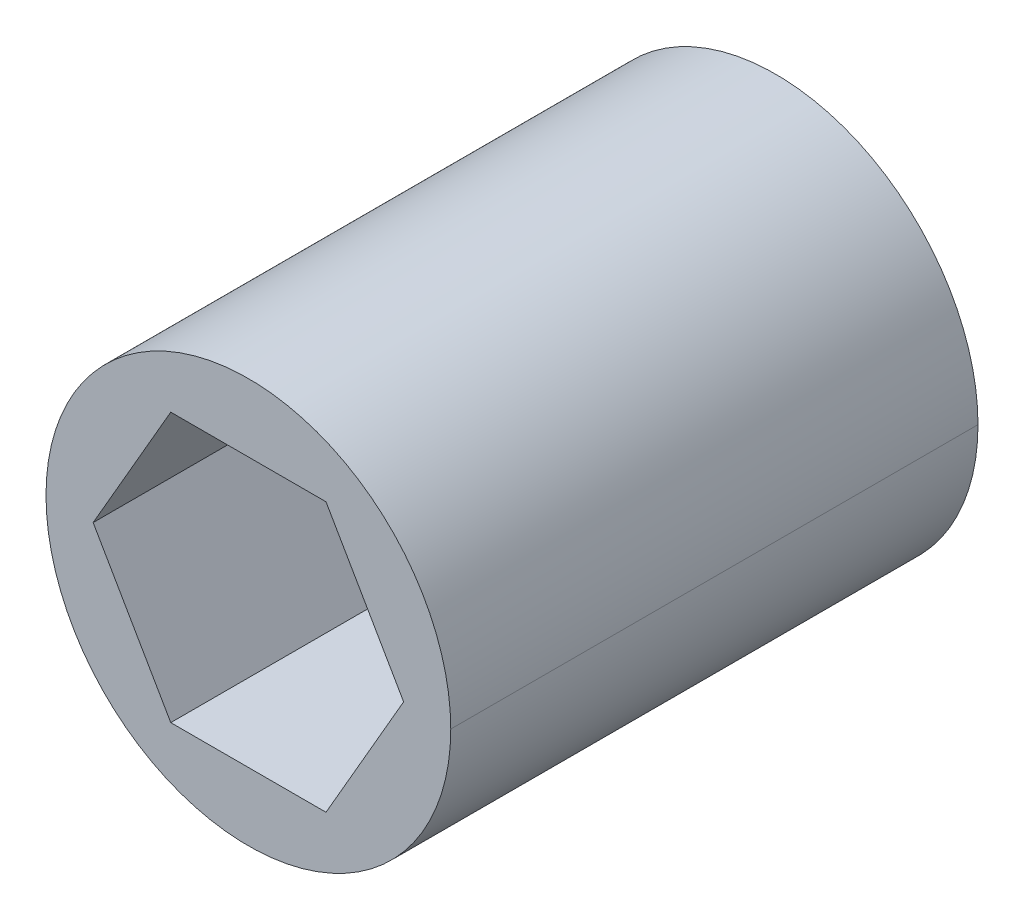
ISO-10303-21;
HEADER;
FILE_DESCRIPTION(('STEP AP214'),'2;1');
FILE_NAME('part.step','',(''),(''),'','','');
FILE_SCHEMA(('AUTOMOTIVE_DESIGN { 1 0 10303 214 1 1 1 1 }'));
ENDSEC;
DATA;
#1=APPLICATION_CONTEXT('core data for automotive mechanical design processes');
#2=APPLICATION_PROTOCOL_DEFINITION('international standard','automotive_design',2000,#1);
#3=PRODUCT_CONTEXT('',#1,'mechanical');
#4=PRODUCT('Part','Part','',(#3));
#5=PRODUCT_RELATED_PRODUCT_CATEGORY('part','',(#4));
#6=PRODUCT_DEFINITION_FORMATION('','',#4);
#7=PRODUCT_DEFINITION_CONTEXT('part definition',#1,'design');
#8=PRODUCT_DEFINITION('design','',#6,#7);
#9=PRODUCT_DEFINITION_SHAPE('','',#8);
#10=(LENGTH_UNIT() NAMED_UNIT(*) SI_UNIT(.MILLI.,.METRE.));
#11=(NAMED_UNIT(*) PLANE_ANGLE_UNIT() SI_UNIT($,.RADIAN.));
#12=(NAMED_UNIT(*) SI_UNIT($,.STERADIAN.) SOLID_ANGLE_UNIT());
#13=UNCERTAINTY_MEASURE_WITH_UNIT(LENGTH_MEASURE(1.E-05),#10,'distance_accuracy_value','');
#14=(GEOMETRIC_REPRESENTATION_CONTEXT(3) GLOBAL_UNCERTAINTY_ASSIGNED_CONTEXT((#13)) GLOBAL_UNIT_ASSIGNED_CONTEXT((#10,
#11,#12)) REPRESENTATION_CONTEXT('',''));
#15=CARTESIAN_POINT('',(0.,0.,0.));
#16=DIRECTION('',(0.,0.,1.));
#17=DIRECTION('',(1.,0.,0.));
#18=AXIS2_PLACEMENT_3D('',#15,#16,#17);
#19=CARTESIAN_POINT('',(-7.47899538708241,0.,12.7));
#20=DIRECTION('',(0.866025403784439,0.5,0.));
#21=DIRECTION('',(0.,0.,-1.));
#22=AXIS2_PLACEMENT_3D('',#19,#20,#21);
#23=PLANE('',#22);
#24=DIRECTION('',(0.5,-0.866025403784439,0.));
#25=VECTOR('',#24,1.);
#26=CARTESIAN_POINT('',(-7.47899538708241,0.,-12.7));
#27=LINE('',#26,#25);
#28=CARTESIAN_POINT('',(-7.47899538708241,0.,-12.7));
#29=VERTEX_POINT('',#28);
#30=CARTESIAN_POINT('',(-3.7394976935412,-6.477,-12.7));
#31=VERTEX_POINT('',#30);
#32=EDGE_CURVE('E153',#29,#31,#27,.T.);
#33=ORIENTED_EDGE('',*,*,#32,.F.);
#34=DIRECTION('',(0.,0.,-1.));
#35=VECTOR('',#34,1.);
#36=CARTESIAN_POINT('',(-7.47899538708241,0.,12.7));
#37=LINE('',#36,#35);
#38=CARTESIAN_POINT('',(-7.47899538708242,0.,12.7));
#39=VERTEX_POINT('',#38);
#40=EDGE_CURVE('E10',#39,#29,#37,.T.);
#41=ORIENTED_EDGE('',*,*,#40,.F.);
#42=DIRECTION('',(0.5,-0.866025403784439,0.));
#43=VECTOR('',#42,1.);
#44=CARTESIAN_POINT('',(-7.47899538708241,0.,12.7));
#45=LINE('',#44,#43);
#46=CARTESIAN_POINT('',(-3.7394976935412,-6.477,12.7));
#47=VERTEX_POINT('',#46);
#48=EDGE_CURVE('E162',#39,#47,#45,.T.);
#49=ORIENTED_EDGE('',*,*,#48,.T.);
#50=DIRECTION('',(0.,0.,-1.));
#51=VECTOR('',#50,1.);
#52=CARTESIAN_POINT('',(-3.7394976935412,-6.477,12.7));
#53=LINE('',#52,#51);
#54=EDGE_CURVE('E95',#47,#31,#53,.T.);
#55=ORIENTED_EDGE('',*,*,#54,.T.);
#56=EDGE_LOOP('',(#33,#41,#49,#55));
#57=FACE_BOUND('',#56,.T.);
#58=ADVANCED_FACE('F16',(#57),#23,.T.);
#59=CARTESIAN_POINT('',(-3.73949769354121,6.477,12.7));
#60=DIRECTION('',(0.866025403784439,-0.5,0.));
#61=DIRECTION('',(0.,0.,-1.));
#62=AXIS2_PLACEMENT_3D('',#59,#60,#61);
#63=PLANE('',#62);
#64=DIRECTION('',(-0.5,-0.866025403784439,0.));
#65=VECTOR('',#64,1.);
#66=CARTESIAN_POINT('',(-3.73949769354121,6.477,-12.7));
#67=LINE('',#66,#65);
#68=CARTESIAN_POINT('',(-3.73949769354121,6.477,-12.7));
#69=VERTEX_POINT('',#68);
#70=EDGE_CURVE('E170',#69,#29,#67,.T.);
#71=ORIENTED_EDGE('',*,*,#70,.F.);
#72=DIRECTION('',(0.,0.,-1.));
#73=VECTOR('',#72,1.);
#74=CARTESIAN_POINT('',(-3.73949769354121,6.477,12.7));
#75=LINE('',#74,#73);
#76=CARTESIAN_POINT('',(-3.73949769354121,6.477,12.7));
#77=VERTEX_POINT('',#76);
#78=EDGE_CURVE('E27',#77,#69,#75,.T.);
#79=ORIENTED_EDGE('',*,*,#78,.F.);
#80=DIRECTION('',(-0.5,-0.866025403784439,0.));
#81=VECTOR('',#80,1.);
#82=CARTESIAN_POINT('',(-3.73949769354121,6.477,12.7));
#83=LINE('',#82,#81);
#84=EDGE_CURVE('E158',#77,#39,#83,.T.);
#85=ORIENTED_EDGE('',*,*,#84,.T.);
#86=ORIENTED_EDGE('',*,*,#40,.T.);
#87=EDGE_LOOP('',(#71,#79,#85,#86));
#88=FACE_BOUND('',#87,.T.);
#89=ADVANCED_FACE('F273',(#88),#63,.T.);
#90=CARTESIAN_POINT('',(3.7394976935412,6.477,12.7));
#91=DIRECTION('',(0.,-1.,0.));
#92=DIRECTION('',(0.,0.,-1.));
#93=AXIS2_PLACEMENT_3D('',#90,#91,#92);
#94=PLANE('',#93);
#95=DIRECTION('',(-1.,0.,0.));
#96=VECTOR('',#95,1.);
#97=CARTESIAN_POINT('',(3.7394976935412,6.477,-12.7));
#98=LINE('',#97,#96);
#99=CARTESIAN_POINT('',(3.7394976935412,6.477,-12.7));
#100=VERTEX_POINT('',#99);
#101=EDGE_CURVE('E173',#100,#69,#98,.T.);
#102=ORIENTED_EDGE('',*,*,#101,.F.);
#103=DIRECTION('',(0.,0.,-1.));
#104=VECTOR('',#103,1.);
#105=CARTESIAN_POINT('',(3.7394976935412,6.477,12.7));
#106=LINE('',#105,#104);
#107=CARTESIAN_POINT('',(3.7394976935412,6.477,12.7));
#108=VERTEX_POINT('',#107);
#109=EDGE_CURVE('E150',#108,#100,#106,.T.);
#110=ORIENTED_EDGE('',*,*,#109,.F.);
#111=DIRECTION('',(-1.,0.,0.));
#112=VECTOR('',#111,1.);
#113=CARTESIAN_POINT('',(3.7394976935412,6.477,12.7));
#114=LINE('',#113,#112);
#115=EDGE_CURVE('E161',#108,#77,#114,.T.);
#116=ORIENTED_EDGE('',*,*,#115,.T.);
#117=ORIENTED_EDGE('',*,*,#78,.T.);
#118=EDGE_LOOP('',(#102,#110,#116,#117));
#119=FACE_BOUND('',#118,.T.);
#120=ADVANCED_FACE('F231',(#119),#94,.T.);
#121=CARTESIAN_POINT('',(7.47899538708241,0.,12.7));
#122=DIRECTION('',(-0.866025403784439,-0.5,0.));
#123=DIRECTION('',(-0.5,0.866025403784439,0.));
#124=AXIS2_PLACEMENT_3D('',#121,#122,#123);
#125=PLANE('',#124);
#126=DIRECTION('',(-0.5,0.866025403784439,0.));
#127=VECTOR('',#126,1.);
#128=CARTESIAN_POINT('',(7.47899538708241,0.,-12.7));
#129=LINE('',#128,#127);
#130=CARTESIAN_POINT('',(7.47899538708241,0.,-12.7));
#131=VERTEX_POINT('',#130);
#132=EDGE_CURVE('E20',#131,#100,#129,.T.);
#133=ORIENTED_EDGE('',*,*,#132,.F.);
#134=DIRECTION('',(0.,0.,-1.));
#135=VECTOR('',#134,1.);
#136=CARTESIAN_POINT('',(7.47899538708241,0.,12.7));
#137=LINE('',#136,#135);
#138=CARTESIAN_POINT('',(7.47899538708241,0.,12.7));
#139=VERTEX_POINT('',#138);
#140=EDGE_CURVE('E155',#139,#131,#137,.T.);
#141=ORIENTED_EDGE('',*,*,#140,.F.);
#142=DIRECTION('',(-0.5,0.866025403784439,0.));
#143=VECTOR('',#142,1.);
#144=CARTESIAN_POINT('',(7.47899538708241,0.,12.7));
#145=LINE('',#144,#143);
#146=EDGE_CURVE('E129',#139,#108,#145,.T.);
#147=ORIENTED_EDGE('',*,*,#146,.T.);
#148=ORIENTED_EDGE('',*,*,#109,.T.);
#149=EDGE_LOOP('',(#133,#141,#147,#148));
#150=FACE_BOUND('',#149,.T.);
#151=ADVANCED_FACE('F229',(#150),#125,.T.);
#152=CARTESIAN_POINT('',(3.73949769354121,-6.477,12.7));
#153=DIRECTION('',(-0.866025403784439,0.5,0.));
#154=DIRECTION('',(0.,0.,1.));
#155=AXIS2_PLACEMENT_3D('',#152,#153,#154);
#156=PLANE('',#155);
#157=DIRECTION('',(0.5,0.866025403784439,0.));
#158=VECTOR('',#157,1.);
#159=CARTESIAN_POINT('',(3.73949769354121,-6.477,-12.7));
#160=LINE('',#159,#158);
#161=CARTESIAN_POINT('',(3.73949769354121,-6.477,-12.7));
#162=VERTEX_POINT('',#161);
#163=EDGE_CURVE('E166',#162,#131,#160,.T.);
#164=ORIENTED_EDGE('',*,*,#163,.F.);
#165=DIRECTION('',(0.,0.,-1.));
#166=VECTOR('',#165,1.);
#167=CARTESIAN_POINT('',(3.73949769354121,-6.477,12.7));
#168=LINE('',#167,#166);
#169=CARTESIAN_POINT('',(3.73949769354121,-6.477,12.7));
#170=VERTEX_POINT('',#169);
#171=EDGE_CURVE('E152',#170,#162,#168,.T.);
#172=ORIENTED_EDGE('',*,*,#171,.F.);
#173=DIRECTION('',(0.5,0.866025403784439,0.));
#174=VECTOR('',#173,1.);
#175=CARTESIAN_POINT('',(3.73949769354121,-6.477,12.7));
#176=LINE('',#175,#174);
#177=EDGE_CURVE('E174',#170,#139,#176,.T.);
#178=ORIENTED_EDGE('',*,*,#177,.T.);
#179=ORIENTED_EDGE('',*,*,#140,.T.);
#180=EDGE_LOOP('',(#164,#172,#178,#179));
#181=FACE_BOUND('',#180,.T.);
#182=ADVANCED_FACE('F18',(#181),#156,.T.);
#183=CARTESIAN_POINT('',(-3.7394976935412,-6.477,12.7));
#184=DIRECTION('',(0.,1.,0.));
#185=DIRECTION('',(1.,0.,0.));
#186=AXIS2_PLACEMENT_3D('',#183,#184,#185);
#187=PLANE('',#186);
#188=DIRECTION('',(1.,0.,0.));
#189=VECTOR('',#188,1.);
#190=CARTESIAN_POINT('',(-3.7394976935412,-6.477,-12.7));
#191=LINE('',#190,#189);
#192=EDGE_CURVE('E128',#31,#162,#191,.T.);
#193=ORIENTED_EDGE('',*,*,#192,.F.);
#194=ORIENTED_EDGE('',*,*,#54,.F.);
#195=DIRECTION('',(1.,0.,0.));
#196=VECTOR('',#195,1.);
#197=CARTESIAN_POINT('',(-3.7394976935412,-6.477,12.7));
#198=LINE('',#197,#196);
#199=EDGE_CURVE('E177',#47,#170,#198,.T.);
#200=ORIENTED_EDGE('',*,*,#199,.T.);
#201=ORIENTED_EDGE('',*,*,#171,.T.);
#202=EDGE_LOOP('',(#193,#194,#200,#201));
#203=FACE_BOUND('',#202,.T.);
#204=ADVANCED_FACE('F201',(#203),#187,.T.);
#205=CARTESIAN_POINT('',(0.,0.,12.7));
#206=DIRECTION('',(0.,0.,-1.));
#207=DIRECTION('',(-1.,0.,0.));
#208=AXIS2_PLACEMENT_3D('',#205,#206,#207);
#209=CYLINDRICAL_SURFACE('',#208,9.75);
#210=DIRECTION('',(0.,0.,-1.));
#211=VECTOR('',#210,1.);
#212=CARTESIAN_POINT('',(9.75,0.,12.7));
#213=LINE('',#212,#211);
#214=CARTESIAN_POINT('',(9.75,0.,12.7));
#215=VERTEX_POINT('',#214);
#216=CARTESIAN_POINT('',(9.75,0.,-12.7));
#217=VERTEX_POINT('',#216);
#218=EDGE_CURVE('E122',#215,#217,#213,.T.);
#219=ORIENTED_EDGE('',*,*,#218,.F.);
#220=CARTESIAN_POINT('',(0.,0.,12.7));
#221=DIRECTION('',(0.,0.,1.));
#222=DIRECTION('',(1.,0.,0.));
#223=AXIS2_PLACEMENT_3D('',#220,#221,#222);
#224=CIRCLE('',#223,9.75);
#225=CARTESIAN_POINT('',(-9.75,0.,12.7));
#226=VERTEX_POINT('',#225);
#227=EDGE_CURVE('E107',#226,#215,#224,.T.);
#228=ORIENTED_EDGE('',*,*,#227,.F.);
#229=DIRECTION('',(0.,0.,-1.));
#230=VECTOR('',#229,1.);
#231=CARTESIAN_POINT('',(-9.75,0.,12.7));
#232=LINE('',#231,#230);
#233=CARTESIAN_POINT('',(-9.75,0.,-12.7));
#234=VERTEX_POINT('',#233);
#235=EDGE_CURVE('E124',#226,#234,#232,.T.);
#236=ORIENTED_EDGE('',*,*,#235,.T.);
#237=CARTESIAN_POINT('',(0.,0.,-12.7));
#238=DIRECTION('',(0.,0.,1.));
#239=DIRECTION('',(1.,0.,0.));
#240=AXIS2_PLACEMENT_3D('',#237,#238,#239);
#241=CIRCLE('',#240,9.75);
#242=EDGE_CURVE('E118',#234,#217,#241,.T.);
#243=ORIENTED_EDGE('',*,*,#242,.T.);
#244=EDGE_LOOP('',(#219,#228,#236,#243));
#245=FACE_BOUND('',#244,.T.);
#246=ADVANCED_FACE('F120',(#245),#209,.T.);
#247=CARTESIAN_POINT('',(0.,0.,-12.7));
#248=DIRECTION('',(0.,0.,1.));
#249=DIRECTION('',(1.,0.,0.));
#250=AXIS2_PLACEMENT_3D('',#247,#248,#249);
#251=PLANE('',#250);
#252=ORIENTED_EDGE('',*,*,#192,.T.);
#253=ORIENTED_EDGE('',*,*,#163,.T.);
#254=ORIENTED_EDGE('',*,*,#132,.T.);
#255=ORIENTED_EDGE('',*,*,#101,.T.);
#256=ORIENTED_EDGE('',*,*,#70,.T.);
#257=ORIENTED_EDGE('',*,*,#32,.T.);
#258=EDGE_LOOP('',(#252,#253,#254,#255,#256,#257));
#259=FACE_BOUND('',#258,.T.);
#260=ORIENTED_EDGE('',*,*,#242,.F.);
#261=CARTESIAN_POINT('',(0.,0.,-12.7));
#262=DIRECTION('',(0.,0.,1.));
#263=DIRECTION('',(1.,0.,0.));
#264=AXIS2_PLACEMENT_3D('',#261,#262,#263);
#265=CIRCLE('',#264,9.75);
#266=EDGE_CURVE('E131',#217,#234,#265,.T.);
#267=ORIENTED_EDGE('',*,*,#266,.F.);
#268=EDGE_LOOP('',(#260,#267));
#269=FACE_BOUND('',#268,.T.);
#270=ADVANCED_FACE('F132',(#259,#269),#251,.F.);
#271=CARTESIAN_POINT('',(0.,0.,12.7));
#272=DIRECTION('',(0.,0.,1.));
#273=DIRECTION('',(1.,0.,0.));
#274=AXIS2_PLACEMENT_3D('',#271,#272,#273);
#275=PLANE('',#274);
#276=ORIENTED_EDGE('',*,*,#177,.F.);
#277=ORIENTED_EDGE('',*,*,#199,.F.);
#278=ORIENTED_EDGE('',*,*,#48,.F.);
#279=ORIENTED_EDGE('',*,*,#84,.F.);
#280=ORIENTED_EDGE('',*,*,#115,.F.);
#281=ORIENTED_EDGE('',*,*,#146,.F.);
#282=EDGE_LOOP('',(#276,#277,#278,#279,#280,#281));
#283=FACE_BOUND('',#282,.T.);
#284=ORIENTED_EDGE('',*,*,#227,.T.);
#285=CARTESIAN_POINT('',(0.,0.,12.7));
#286=DIRECTION('',(0.,0.,1.));
#287=DIRECTION('',(1.,0.,0.));
#288=AXIS2_PLACEMENT_3D('',#285,#286,#287);
#289=CIRCLE('',#288,9.75);
#290=EDGE_CURVE('E137',#215,#226,#289,.T.);
#291=ORIENTED_EDGE('',*,*,#290,.T.);
#292=EDGE_LOOP('',(#284,#291));
#293=FACE_BOUND('',#292,.T.);
#294=ADVANCED_FACE('F213',(#283,#293),#275,.T.);
#295=CARTESIAN_POINT('',(0.,0.,12.7));
#296=DIRECTION('',(0.,0.,-1.));
#297=DIRECTION('',(-1.,0.,0.));
#298=AXIS2_PLACEMENT_3D('',#295,#296,#297);
#299=CYLINDRICAL_SURFACE('',#298,9.75);
#300=ORIENTED_EDGE('',*,*,#290,.F.);
#301=ORIENTED_EDGE('',*,*,#218,.T.);
#302=ORIENTED_EDGE('',*,*,#266,.T.);
#303=ORIENTED_EDGE('',*,*,#235,.F.);
#304=EDGE_LOOP('',(#300,#301,#302,#303));
#305=FACE_BOUND('',#304,.T.);
#306=ADVANCED_FACE('F136',(#305),#299,.T.);
#307=CLOSED_SHELL('',(#58,#89,#120,#151,#182,#204,#246,#270,#294,#306));
#308=MANIFOLD_SOLID_BREP('B1',#307);
#309=ADVANCED_BREP_SHAPE_REPRESENTATION('',(#18,#308),#14);
#310=SHAPE_DEFINITION_REPRESENTATION(#9,#309);
ENDSEC;
END-ISO-10303-21;
